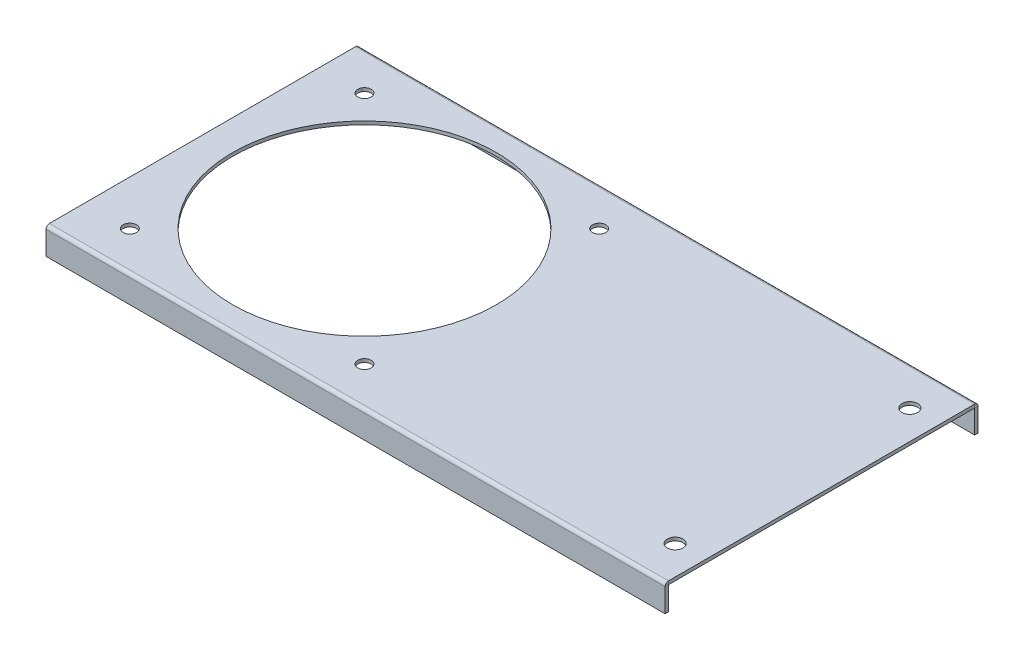
ISO-10303-21;
HEADER;
FILE_DESCRIPTION(('STEP AP214'),'2;1');
FILE_NAME('part.step','',(''),(''),'','','');
FILE_SCHEMA(('AUTOMOTIVE_DESIGN { 1 0 10303 214 1 1 1 1 }'));
ENDSEC;
DATA;
#1=APPLICATION_CONTEXT('core data for automotive mechanical design processes');
#2=APPLICATION_PROTOCOL_DEFINITION('international standard','automotive_design',2000,#1);
#3=PRODUCT_CONTEXT('',#1,'mechanical');
#4=PRODUCT('Part','Part','',(#3));
#5=PRODUCT_RELATED_PRODUCT_CATEGORY('part','',(#4));
#6=PRODUCT_DEFINITION_FORMATION('','',#4);
#7=PRODUCT_DEFINITION_CONTEXT('part definition',#1,'design');
#8=PRODUCT_DEFINITION('design','',#6,#7);
#9=PRODUCT_DEFINITION_SHAPE('','',#8);
#10=(LENGTH_UNIT() NAMED_UNIT(*) SI_UNIT(.MILLI.,.METRE.));
#11=(NAMED_UNIT(*) PLANE_ANGLE_UNIT() SI_UNIT($,.RADIAN.));
#12=(NAMED_UNIT(*) SI_UNIT($,.STERADIAN.) SOLID_ANGLE_UNIT());
#13=UNCERTAINTY_MEASURE_WITH_UNIT(LENGTH_MEASURE(1.E-05),#10,'distance_accuracy_value','');
#14=(GEOMETRIC_REPRESENTATION_CONTEXT(3) GLOBAL_UNCERTAINTY_ASSIGNED_CONTEXT((#13)) GLOBAL_UNIT_ASSIGNED_CONTEXT((#10,
#11,#12)) REPRESENTATION_CONTEXT('',''));
#15=CARTESIAN_POINT('',(0.,0.,0.));
#16=DIRECTION('',(0.,0.,1.));
#17=DIRECTION('',(1.,0.,0.));
#18=AXIS2_PLACEMENT_3D('',#15,#16,#17);
#19=CARTESIAN_POINT('',(138.5,-1.5,68.5));
#20=DIRECTION('',(1.,0.,0.));
#21=DIRECTION('',(0.,0.,-1.));
#22=AXIS2_PLACEMENT_3D('',#19,#20,#21);
#23=PLANE('',#22);
#24=DIRECTION('',(0.,1.,0.));
#25=VECTOR('',#24,1.);
#26=CARTESIAN_POINT('',(138.5,-1.5,68.5));
#27=LINE('',#26,#25);
#28=CARTESIAN_POINT('',(138.5,-1.5,68.5));
#29=VERTEX_POINT('',#28);
#30=CARTESIAN_POINT('',(138.5,0.,68.5));
#31=VERTEX_POINT('',#30);
#32=EDGE_CURVE('E11',#29,#31,#27,.T.);
#33=ORIENTED_EDGE('',*,*,#32,.F.);
#34=DIRECTION('',(0.,0.,-1.));
#35=VECTOR('',#34,1.);
#36=CARTESIAN_POINT('',(138.5,-1.5,70.));
#37=LINE('',#36,#35);
#38=CARTESIAN_POINT('',(138.5,-1.49999999999998,-68.5));
#39=VERTEX_POINT('',#38);
#40=EDGE_CURVE('E141',#29,#39,#37,.T.);
#41=ORIENTED_EDGE('',*,*,#40,.T.);
#42=DIRECTION('',(0.,1.,0.));
#43=VECTOR('',#42,1.);
#44=CARTESIAN_POINT('',(138.5,-1.49999999999998,-68.5));
#45=LINE('',#44,#43);
#46=CARTESIAN_POINT('',(138.5,0.,-68.5));
#47=VERTEX_POINT('',#46);
#48=EDGE_CURVE('E204',#39,#47,#45,.T.);
#49=ORIENTED_EDGE('',*,*,#48,.T.);
#50=DIRECTION('',(0.,0.,-1.));
#51=VECTOR('',#50,1.);
#52=CARTESIAN_POINT('',(138.5,0.,70.));
#53=LINE('',#52,#51);
#54=EDGE_CURVE('E262',#31,#47,#53,.T.);
#55=ORIENTED_EDGE('',*,*,#54,.F.);
#56=EDGE_LOOP('',(#33,#41,#49,#55));
#57=FACE_BOUND('',#56,.T.);
#58=ADVANCED_FACE('F35',(#57),#23,.T.);
#59=CARTESIAN_POINT('',(138.5,-1.5,68.5));
#60=DIRECTION('',(1.,0.,0.));
#61=DIRECTION('',(0.,0.,-1.));
#62=AXIS2_PLACEMENT_3D('',#59,#60,#61);
#63=PLANE('',#62);
#64=DIRECTION('',(0.,0.,1.));
#65=VECTOR('',#64,1.);
#66=CARTESIAN_POINT('',(138.5,-1.5,68.5));
#67=LINE('',#66,#65);
#68=CARTESIAN_POINT('',(138.5,-1.5,70.));
#69=VERTEX_POINT('',#68);
#70=EDGE_CURVE('E44',#29,#69,#67,.T.);
#71=ORIENTED_EDGE('',*,*,#70,.F.);
#72=ORIENTED_EDGE('',*,*,#32,.T.);
#73=CARTESIAN_POINT('',(138.5,-1.5,68.5));
#74=DIRECTION('',(1.,0.,0.));
#75=DIRECTION('',(0.,0.,-1.));
#76=AXIS2_PLACEMENT_3D('',#73,#74,#75);
#77=CIRCLE('',#76,1.5);
#78=EDGE_CURVE('E148',#69,#31,#77,.F.);
#79=ORIENTED_EDGE('',*,*,#78,.F.);
#80=EDGE_LOOP('',(#71,#72,#79));
#81=FACE_BOUND('',#80,.T.);
#82=ADVANCED_FACE('F274',(#81),#63,.T.);
#83=CARTESIAN_POINT('',(-138.5,-1.5,68.5));
#84=DIRECTION('',(-1.,0.,0.));
#85=DIRECTION('',(0.,0.,1.));
#86=AXIS2_PLACEMENT_3D('',#83,#84,#85);
#87=PLANE('',#86);
#88=DIRECTION('',(0.,0.,1.));
#89=VECTOR('',#88,1.);
#90=CARTESIAN_POINT('',(-138.5,-1.5,68.5));
#91=LINE('',#90,#89);
#92=CARTESIAN_POINT('',(-138.5,-1.5,68.5));
#93=VERTEX_POINT('',#92);
#94=CARTESIAN_POINT('',(-138.5,-1.5,70.));
#95=VERTEX_POINT('',#94);
#96=EDGE_CURVE('E88',#93,#95,#91,.T.);
#97=ORIENTED_EDGE('',*,*,#96,.F.);
#98=DIRECTION('',(0.,1.,0.));
#99=VECTOR('',#98,1.);
#100=CARTESIAN_POINT('',(-138.5,-12.,68.5));
#101=LINE('',#100,#99);
#102=CARTESIAN_POINT('',(-138.5,-12.,68.5));
#103=VERTEX_POINT('',#102);
#104=EDGE_CURVE('E176',#103,#93,#101,.T.);
#105=ORIENTED_EDGE('',*,*,#104,.F.);
#106=DIRECTION('',(0.,0.,1.));
#107=VECTOR('',#106,1.);
#108=CARTESIAN_POINT('',(-138.5,-12.,68.5));
#109=LINE('',#108,#107);
#110=CARTESIAN_POINT('',(-138.5,-12.,70.));
#111=VERTEX_POINT('',#110);
#112=EDGE_CURVE('E128',#103,#111,#109,.T.);
#113=ORIENTED_EDGE('',*,*,#112,.T.);
#114=DIRECTION('',(0.,1.,0.));
#115=VECTOR('',#114,1.);
#116=CARTESIAN_POINT('',(-138.5,-12.,70.));
#117=LINE('',#116,#115);
#118=EDGE_CURVE('E173',#111,#95,#117,.T.);
#119=ORIENTED_EDGE('',*,*,#118,.T.);
#120=EDGE_LOOP('',(#97,#105,#113,#119));
#121=FACE_BOUND('',#120,.T.);
#122=ADVANCED_FACE('F278',(#121),#87,.T.);
#123=CARTESIAN_POINT('',(-138.5,-1.5,68.5));
#124=DIRECTION('',(-1.,0.,0.));
#125=DIRECTION('',(0.,0.,1.));
#126=AXIS2_PLACEMENT_3D('',#123,#124,#125);
#127=PLANE('',#126);
#128=DIRECTION('',(0.,1.,0.));
#129=VECTOR('',#128,1.);
#130=CARTESIAN_POINT('',(-138.5,-1.5,68.5));
#131=LINE('',#130,#129);
#132=CARTESIAN_POINT('',(-138.5,0.,68.5));
#133=VERTEX_POINT('',#132);
#134=EDGE_CURVE('E207',#93,#133,#131,.T.);
#135=ORIENTED_EDGE('',*,*,#134,.F.);
#136=ORIENTED_EDGE('',*,*,#96,.T.);
#137=CARTESIAN_POINT('',(-138.5,-1.5,68.5));
#138=DIRECTION('',(1.,0.,0.));
#139=DIRECTION('',(0.,0.,-1.));
#140=AXIS2_PLACEMENT_3D('',#137,#138,#139);
#141=CIRCLE('',#140,1.5);
#142=EDGE_CURVE('E170',#95,#133,#141,.F.);
#143=ORIENTED_EDGE('',*,*,#142,.T.);
#144=EDGE_LOOP('',(#135,#136,#143));
#145=FACE_BOUND('',#144,.T.);
#146=ADVANCED_FACE('F284',(#145),#127,.T.);
#147=CARTESIAN_POINT('',(138.5,-1.49999999999998,-68.5));
#148=DIRECTION('',(1.,0.,0.));
#149=DIRECTION('',(0.,0.,-1.));
#150=AXIS2_PLACEMENT_3D('',#147,#148,#149);
#151=PLANE('',#150);
#152=DIRECTION('',(0.,0.,-1.));
#153=VECTOR('',#152,1.);
#154=CARTESIAN_POINT('',(138.5,-1.49999999999998,-68.5));
#155=LINE('',#154,#153);
#156=CARTESIAN_POINT('',(138.5,-1.49999999999998,-70.));
#157=VERTEX_POINT('',#156);
#158=EDGE_CURVE('E53',#39,#157,#155,.T.);
#159=ORIENTED_EDGE('',*,*,#158,.F.);
#160=DIRECTION('',(0.,-1.,0.));
#161=VECTOR('',#160,1.);
#162=CARTESIAN_POINT('',(138.5,0.,-68.5));
#163=LINE('',#162,#161);
#164=CARTESIAN_POINT('',(138.5,-12.,-68.5));
#165=VERTEX_POINT('',#164);
#166=EDGE_CURVE('E101',#39,#165,#163,.T.);
#167=ORIENTED_EDGE('',*,*,#166,.T.);
#168=DIRECTION('',(0.,0.,1.));
#169=VECTOR('',#168,1.);
#170=CARTESIAN_POINT('',(138.5,-12.,-70.));
#171=LINE('',#170,#169);
#172=CARTESIAN_POINT('',(138.5,-12.,-70.));
#173=VERTEX_POINT('',#172);
#174=EDGE_CURVE('E253',#173,#165,#171,.T.);
#175=ORIENTED_EDGE('',*,*,#174,.F.);
#176=DIRECTION('',(0.,-1.,0.));
#177=VECTOR('',#176,1.);
#178=CARTESIAN_POINT('',(138.5,0.,-70.));
#179=LINE('',#178,#177);
#180=EDGE_CURVE('E256',#157,#173,#179,.T.);
#181=ORIENTED_EDGE('',*,*,#180,.F.);
#182=EDGE_LOOP('',(#159,#167,#175,#181));
#183=FACE_BOUND('',#182,.T.);
#184=ADVANCED_FACE('F286',(#183),#151,.T.);
#185=CARTESIAN_POINT('',(138.5,-1.49999999999998,-68.5));
#186=DIRECTION('',(1.,0.,0.));
#187=DIRECTION('',(0.,0.,-1.));
#188=AXIS2_PLACEMENT_3D('',#185,#186,#187);
#189=PLANE('',#188);
#190=ORIENTED_EDGE('',*,*,#48,.F.);
#191=ORIENTED_EDGE('',*,*,#158,.T.);
#192=CARTESIAN_POINT('',(138.5,-1.49999999999998,-68.5));
#193=DIRECTION('',(1.,0.,0.));
#194=DIRECTION('',(0.,0.,-1.));
#195=AXIS2_PLACEMENT_3D('',#192,#193,#194);
#196=CIRCLE('',#195,1.5);
#197=EDGE_CURVE('E259',#47,#157,#196,.F.);
#198=ORIENTED_EDGE('',*,*,#197,.F.);
#199=EDGE_LOOP('',(#190,#191,#198));
#200=FACE_BOUND('',#199,.T.);
#201=ADVANCED_FACE('F292',(#200),#189,.T.);
#202=CARTESIAN_POINT('',(-138.5,-1.49999999999998,-68.5));
#203=DIRECTION('',(-1.,0.,0.));
#204=DIRECTION('',(0.,0.,1.));
#205=AXIS2_PLACEMENT_3D('',#202,#203,#204);
#206=PLANE('',#205);
#207=DIRECTION('',(0.,1.,0.));
#208=VECTOR('',#207,1.);
#209=CARTESIAN_POINT('',(-138.5,-1.49999999999998,-68.5));
#210=LINE('',#209,#208);
#211=CARTESIAN_POINT('',(-138.5,-1.49999999999998,-68.5));
#212=VERTEX_POINT('',#211);
#213=CARTESIAN_POINT('',(-138.5,0.,-68.5));
#214=VERTEX_POINT('',#213);
#215=EDGE_CURVE('E95',#212,#214,#210,.T.);
#216=ORIENTED_EDGE('',*,*,#215,.F.);
#217=DIRECTION('',(0.,0.,-1.));
#218=VECTOR('',#217,1.);
#219=CARTESIAN_POINT('',(-138.5,-1.5,70.));
#220=LINE('',#219,#218);
#221=EDGE_CURVE('E178',#93,#212,#220,.T.);
#222=ORIENTED_EDGE('',*,*,#221,.F.);
#223=ORIENTED_EDGE('',*,*,#134,.T.);
#224=DIRECTION('',(0.,0.,-1.));
#225=VECTOR('',#224,1.);
#226=CARTESIAN_POINT('',(-138.5,0.,70.));
#227=LINE('',#226,#225);
#228=EDGE_CURVE('E168',#133,#214,#227,.T.);
#229=ORIENTED_EDGE('',*,*,#228,.T.);
#230=EDGE_LOOP('',(#216,#222,#223,#229));
#231=FACE_BOUND('',#230,.T.);
#232=ADVANCED_FACE('F282',(#231),#206,.T.);
#233=CARTESIAN_POINT('',(-138.5,-1.49999999999998,-68.5));
#234=DIRECTION('',(-1.,0.,0.));
#235=DIRECTION('',(0.,0.,1.));
#236=AXIS2_PLACEMENT_3D('',#233,#234,#235);
#237=PLANE('',#236);
#238=DIRECTION('',(0.,0.,-1.));
#239=VECTOR('',#238,1.);
#240=CARTESIAN_POINT('',(-138.5,-1.49999999999998,-68.5));
#241=LINE('',#240,#239);
#242=CARTESIAN_POINT('',(-138.5,-1.49999999999998,-70.));
#243=VERTEX_POINT('',#242);
#244=EDGE_CURVE('E201',#212,#243,#241,.T.);
#245=ORIENTED_EDGE('',*,*,#244,.F.);
#246=ORIENTED_EDGE('',*,*,#215,.T.);
#247=CARTESIAN_POINT('',(-138.5,-1.49999999999998,-68.5));
#248=DIRECTION('',(1.,0.,0.));
#249=DIRECTION('',(0.,0.,-1.));
#250=AXIS2_PLACEMENT_3D('',#247,#248,#249);
#251=CIRCLE('',#250,1.5);
#252=EDGE_CURVE('E165',#214,#243,#251,.F.);
#253=ORIENTED_EDGE('',*,*,#252,.T.);
#254=EDGE_LOOP('',(#245,#246,#253));
#255=FACE_BOUND('',#254,.T.);
#256=ADVANCED_FACE('F311',(#255),#237,.T.);
#257=CARTESIAN_POINT('',(138.5,0.,-68.5));
#258=DIRECTION('',(0.,0.,-1.));
#259=DIRECTION('',(0.,1.,0.));
#260=AXIS2_PLACEMENT_3D('',#257,#258,#259);
#261=PLANE('',#260);
#262=DIRECTION('',(0.,-1.,0.));
#263=VECTOR('',#262,1.);
#264=CARTESIAN_POINT('',(-138.5,0.,-68.5));
#265=LINE('',#264,#263);
#266=CARTESIAN_POINT('',(-138.5,-12.,-68.5));
#267=VERTEX_POINT('',#266);
#268=EDGE_CURVE('E155',#212,#267,#265,.T.);
#269=ORIENTED_EDGE('',*,*,#268,.T.);
#270=DIRECTION('',(-1.,0.,0.));
#271=VECTOR('',#270,1.);
#272=CARTESIAN_POINT('',(138.5,-12.,-68.5));
#273=LINE('',#272,#271);
#274=EDGE_CURVE('E199',#165,#267,#273,.T.);
#275=ORIENTED_EDGE('',*,*,#274,.F.);
#276=ORIENTED_EDGE('',*,*,#166,.F.);
#277=DIRECTION('',(-1.,0.,0.));
#278=VECTOR('',#277,1.);
#279=CARTESIAN_POINT('',(138.5,-1.49999999999998,-68.5));
#280=LINE('',#279,#278);
#281=EDGE_CURVE('E154',#39,#212,#280,.T.);
#282=ORIENTED_EDGE('',*,*,#281,.T.);
#283=EDGE_LOOP('',(#269,#275,#276,#282));
#284=FACE_BOUND('',#283,.T.);
#285=ADVANCED_FACE('F317',(#284),#261,.F.);
#286=CARTESIAN_POINT('',(138.5,-12.,-70.));
#287=DIRECTION('',(0.,-1.,0.));
#288=DIRECTION('',(0.,0.,-1.));
#289=AXIS2_PLACEMENT_3D('',#286,#287,#288);
#290=PLANE('',#289);
#291=DIRECTION('',(0.,0.,1.));
#292=VECTOR('',#291,1.);
#293=CARTESIAN_POINT('',(-138.5,-12.,-70.));
#294=LINE('',#293,#292);
#295=CARTESIAN_POINT('',(-138.5,-12.,-70.));
#296=VERTEX_POINT('',#295);
#297=EDGE_CURVE('E158',#296,#267,#294,.T.);
#298=ORIENTED_EDGE('',*,*,#297,.F.);
#299=DIRECTION('',(-1.,0.,0.));
#300=VECTOR('',#299,1.);
#301=CARTESIAN_POINT('',(138.5,-12.,-70.));
#302=LINE('',#301,#300);
#303=EDGE_CURVE('E197',#173,#296,#302,.T.);
#304=ORIENTED_EDGE('',*,*,#303,.F.);
#305=ORIENTED_EDGE('',*,*,#174,.T.);
#306=ORIENTED_EDGE('',*,*,#274,.T.);
#307=EDGE_LOOP('',(#298,#304,#305,#306));
#308=FACE_BOUND('',#307,.T.);
#309=ADVANCED_FACE('F319',(#308),#290,.T.);
#310=CARTESIAN_POINT('',(138.5,0.,-70.));
#311=DIRECTION('',(0.,0.,-1.));
#312=DIRECTION('',(0.,1.,0.));
#313=AXIS2_PLACEMENT_3D('',#310,#311,#312);
#314=PLANE('',#313);
#315=DIRECTION('',(0.,-1.,0.));
#316=VECTOR('',#315,1.);
#317=CARTESIAN_POINT('',(-138.5,0.,-70.));
#318=LINE('',#317,#316);
#319=EDGE_CURVE('E162',#243,#296,#318,.T.);
#320=ORIENTED_EDGE('',*,*,#319,.F.);
#321=DIRECTION('',(-1.,0.,0.));
#322=VECTOR('',#321,1.);
#323=CARTESIAN_POINT('',(138.5,-1.49999999999998,-70.));
#324=LINE('',#323,#322);
#325=EDGE_CURVE('E194',#157,#243,#324,.T.);
#326=ORIENTED_EDGE('',*,*,#325,.F.);
#327=ORIENTED_EDGE('',*,*,#180,.T.);
#328=ORIENTED_EDGE('',*,*,#303,.T.);
#329=EDGE_LOOP('',(#320,#326,#327,#328));
#330=FACE_BOUND('',#329,.T.);
#331=ADVANCED_FACE('F321',(#330),#314,.T.);
#332=CARTESIAN_POINT('',(138.5,-1.49999999999998,-68.5));
#333=DIRECTION('',(-1.,0.,0.));
#334=DIRECTION('',(0.,0.,1.));
#335=AXIS2_PLACEMENT_3D('',#332,#333,#334);
#336=CYLINDRICAL_SURFACE('',#335,1.5);
#337=ORIENTED_EDGE('',*,*,#252,.F.);
#338=DIRECTION('',(-1.,0.,0.));
#339=VECTOR('',#338,1.);
#340=CARTESIAN_POINT('',(138.5,0.,-68.5));
#341=LINE('',#340,#339);
#342=EDGE_CURVE('E191',#47,#214,#341,.T.);
#343=ORIENTED_EDGE('',*,*,#342,.F.);
#344=ORIENTED_EDGE('',*,*,#197,.T.);
#345=ORIENTED_EDGE('',*,*,#325,.T.);
#346=EDGE_LOOP('',(#337,#343,#344,#345));
#347=FACE_BOUND('',#346,.T.);
#348=ADVANCED_FACE('F307',(#347),#336,.T.);
#349=CARTESIAN_POINT('',(138.5,0.,70.));
#350=DIRECTION('',(0.,1.,0.));
#351=DIRECTION('',(0.,0.,1.));
#352=AXIS2_PLACEMENT_3D('',#349,#350,#351);
#353=PLANE('',#352);
#354=CARTESIAN_POINT('',(125.5,0.,52.5));
#355=DIRECTION('',(0.,1.,0.));
#356=DIRECTION('',(0.,0.,1.));
#357=AXIS2_PLACEMENT_3D('',#354,#355,#356);
#358=CIRCLE('',#357,3.49999999999999);
#359=CARTESIAN_POINT('',(125.5,0.,56.));
#360=VERTEX_POINT('',#359);
#361=EDGE_CURVE('E241',#360,#360,#358,.T.);
#362=ORIENTED_EDGE('',*,*,#361,.F.);
#363=EDGE_LOOP('',(#362));
#364=FACE_BOUND('',#363,.T.);
#365=CARTESIAN_POINT('',(125.5,0.,-52.5));
#366=DIRECTION('',(0.,1.,0.));
#367=DIRECTION('',(0.,0.,1.));
#368=AXIS2_PLACEMENT_3D('',#365,#366,#367);
#369=CIRCLE('',#368,3.49999999999999);
#370=CARTESIAN_POINT('',(125.5,0.,-49.));
#371=VERTEX_POINT('',#370);
#372=EDGE_CURVE('E231',#371,#371,#369,.T.);
#373=ORIENTED_EDGE('',*,*,#372,.F.);
#374=EDGE_LOOP('',(#373));
#375=FACE_BOUND('',#374,.T.);
#376=CARTESIAN_POINT('',(-118.5,0.,52.5));
#377=DIRECTION('',(0.,1.,0.));
#378=DIRECTION('',(0.,0.,1.));
#379=AXIS2_PLACEMENT_3D('',#376,#377,#378);
#380=CIRCLE('',#379,3.00000000000001);
#381=CARTESIAN_POINT('',(-118.5,0.,55.5));
#382=VERTEX_POINT('',#381);
#383=EDGE_CURVE('E228',#382,#382,#380,.T.);
#384=ORIENTED_EDGE('',*,*,#383,.F.);
#385=EDGE_LOOP('',(#384));
#386=FACE_BOUND('',#385,.T.);
#387=CARTESIAN_POINT('',(-13.5,0.,52.5));
#388=DIRECTION('',(0.,1.,0.));
#389=DIRECTION('',(0.,0.,1.));
#390=AXIS2_PLACEMENT_3D('',#387,#388,#389);
#391=CIRCLE('',#390,3.);
#392=CARTESIAN_POINT('',(-13.5,0.,55.5));
#393=VERTEX_POINT('',#392);
#394=EDGE_CURVE('E225',#393,#393,#391,.T.);
#395=ORIENTED_EDGE('',*,*,#394,.F.);
#396=EDGE_LOOP('',(#395));
#397=FACE_BOUND('',#396,.T.);
#398=CARTESIAN_POINT('',(-13.5,0.,-52.5));
#399=DIRECTION('',(0.,1.,0.));
#400=DIRECTION('',(0.,0.,1.));
#401=AXIS2_PLACEMENT_3D('',#398,#399,#400);
#402=CIRCLE('',#401,3.);
#403=CARTESIAN_POINT('',(-13.5,0.,-49.5));
#404=VERTEX_POINT('',#403);
#405=EDGE_CURVE('E221',#404,#404,#402,.T.);
#406=ORIENTED_EDGE('',*,*,#405,.F.);
#407=EDGE_LOOP('',(#406));
#408=FACE_BOUND('',#407,.T.);
#409=CARTESIAN_POINT('',(-118.5,0.,-52.5));
#410=DIRECTION('',(0.,1.,0.));
#411=DIRECTION('',(0.,0.,1.));
#412=AXIS2_PLACEMENT_3D('',#409,#410,#411);
#413=CIRCLE('',#412,3.00000000000001);
#414=CARTESIAN_POINT('',(-118.5,0.,-49.5));
#415=VERTEX_POINT('',#414);
#416=EDGE_CURVE('E217',#415,#415,#413,.T.);
#417=ORIENTED_EDGE('',*,*,#416,.F.);
#418=EDGE_LOOP('',(#417));
#419=FACE_BOUND('',#418,.T.);
#420=CARTESIAN_POINT('',(-66.,0.,0.));
#421=DIRECTION('',(0.,1.,0.));
#422=DIRECTION('',(0.,0.,1.));
#423=AXIS2_PLACEMENT_3D('',#420,#421,#422);
#424=CIRCLE('',#423,59.);
#425=CARTESIAN_POINT('',(-66.,0.,59.));
#426=VERTEX_POINT('',#425);
#427=EDGE_CURVE('E213',#426,#426,#424,.T.);
#428=ORIENTED_EDGE('',*,*,#427,.F.);
#429=EDGE_LOOP('',(#428));
#430=FACE_BOUND('',#429,.T.);
#431=ORIENTED_EDGE('',*,*,#228,.F.);
#432=DIRECTION('',(-1.,0.,0.));
#433=VECTOR('',#432,1.);
#434=CARTESIAN_POINT('',(138.5,0.,68.5));
#435=LINE('',#434,#433);
#436=EDGE_CURVE('E188',#31,#133,#435,.T.);
#437=ORIENTED_EDGE('',*,*,#436,.F.);
#438=ORIENTED_EDGE('',*,*,#54,.T.);
#439=ORIENTED_EDGE('',*,*,#342,.T.);
#440=EDGE_LOOP('',(#431,#437,#438,#439));
#441=FACE_BOUND('',#440,.T.);
#442=ADVANCED_FACE('F303',(#364,#375,#386,#397,#408,#419,#430,#441),#353,.T.);
#443=CARTESIAN_POINT('',(138.5,-1.5,68.5));
#444=DIRECTION('',(-1.,0.,0.));
#445=DIRECTION('',(0.,0.,1.));
#446=AXIS2_PLACEMENT_3D('',#443,#444,#445);
#447=CYLINDRICAL_SURFACE('',#446,1.5);
#448=ORIENTED_EDGE('',*,*,#142,.F.);
#449=DIRECTION('',(-1.,0.,0.));
#450=VECTOR('',#449,1.);
#451=CARTESIAN_POINT('',(138.5,-1.5,70.));
#452=LINE('',#451,#450);
#453=EDGE_CURVE('E185',#69,#95,#452,.T.);
#454=ORIENTED_EDGE('',*,*,#453,.F.);
#455=ORIENTED_EDGE('',*,*,#78,.T.);
#456=ORIENTED_EDGE('',*,*,#436,.T.);
#457=EDGE_LOOP('',(#448,#454,#455,#456));
#458=FACE_BOUND('',#457,.T.);
#459=ADVANCED_FACE('F269',(#458),#447,.T.);
#460=CARTESIAN_POINT('',(138.5,-12.,70.));
#461=DIRECTION('',(0.,0.,1.));
#462=DIRECTION('',(0.,-1.,0.));
#463=AXIS2_PLACEMENT_3D('',#460,#461,#462);
#464=PLANE('',#463);
#465=ORIENTED_EDGE('',*,*,#118,.F.);
#466=DIRECTION('',(-1.,0.,0.));
#467=VECTOR('',#466,1.);
#468=CARTESIAN_POINT('',(138.5,-12.,70.));
#469=LINE('',#468,#467);
#470=CARTESIAN_POINT('',(138.5,-12.,70.));
#471=VERTEX_POINT('',#470);
#472=EDGE_CURVE('E131',#471,#111,#469,.T.);
#473=ORIENTED_EDGE('',*,*,#472,.F.);
#474=DIRECTION('',(0.,1.,0.));
#475=VECTOR('',#474,1.);
#476=CARTESIAN_POINT('',(138.5,-12.,70.));
#477=LINE('',#476,#475);
#478=EDGE_CURVE('E146',#471,#69,#477,.T.);
#479=ORIENTED_EDGE('',*,*,#478,.T.);
#480=ORIENTED_EDGE('',*,*,#453,.T.);
#481=EDGE_LOOP('',(#465,#473,#479,#480));
#482=FACE_BOUND('',#481,.T.);
#483=ADVANCED_FACE('F277',(#482),#464,.T.);
#484=CARTESIAN_POINT('',(138.5,-12.,68.5));
#485=DIRECTION('',(0.,-1.,0.));
#486=DIRECTION('',(0.,0.,-1.));
#487=AXIS2_PLACEMENT_3D('',#484,#485,#486);
#488=PLANE('',#487);
#489=ORIENTED_EDGE('',*,*,#112,.F.);
#490=DIRECTION('',(-1.,0.,0.));
#491=VECTOR('',#490,1.);
#492=CARTESIAN_POINT('',(138.5,-12.,68.5));
#493=LINE('',#492,#491);
#494=CARTESIAN_POINT('',(138.5,-12.,68.5));
#495=VERTEX_POINT('',#494);
#496=EDGE_CURVE('E122',#495,#103,#493,.T.);
#497=ORIENTED_EDGE('',*,*,#496,.F.);
#498=DIRECTION('',(0.,0.,1.));
#499=VECTOR('',#498,1.);
#500=CARTESIAN_POINT('',(138.5,-12.,68.5));
#501=LINE('',#500,#499);
#502=EDGE_CURVE('E126',#495,#471,#501,.T.);
#503=ORIENTED_EDGE('',*,*,#502,.T.);
#504=ORIENTED_EDGE('',*,*,#472,.T.);
#505=EDGE_LOOP('',(#489,#497,#503,#504));
#506=FACE_BOUND('',#505,.T.);
#507=ADVANCED_FACE('F124',(#506),#488,.T.);
#508=CARTESIAN_POINT('',(138.5,-12.,68.5));
#509=DIRECTION('',(0.,0.,1.));
#510=DIRECTION('',(0.,-1.,0.));
#511=AXIS2_PLACEMENT_3D('',#508,#509,#510);
#512=PLANE('',#511);
#513=ORIENTED_EDGE('',*,*,#104,.T.);
#514=DIRECTION('',(-1.,0.,0.));
#515=VECTOR('',#514,1.);
#516=CARTESIAN_POINT('',(138.5,-1.5,68.5));
#517=LINE('',#516,#515);
#518=EDGE_CURVE('E132',#29,#93,#517,.T.);
#519=ORIENTED_EDGE('',*,*,#518,.F.);
#520=DIRECTION('',(0.,1.,0.));
#521=VECTOR('',#520,1.);
#522=CARTESIAN_POINT('',(138.5,-12.,68.5));
#523=LINE('',#522,#521);
#524=EDGE_CURVE('E136',#495,#29,#523,.T.);
#525=ORIENTED_EDGE('',*,*,#524,.F.);
#526=ORIENTED_EDGE('',*,*,#496,.T.);
#527=EDGE_LOOP('',(#513,#519,#525,#526));
#528=FACE_BOUND('',#527,.T.);
#529=ADVANCED_FACE('F137',(#528),#512,.F.);
#530=CARTESIAN_POINT('',(138.5,-1.5,70.));
#531=DIRECTION('',(0.,1.,0.));
#532=DIRECTION('',(0.,0.,1.));
#533=AXIS2_PLACEMENT_3D('',#530,#531,#532);
#534=PLANE('',#533);
#535=CARTESIAN_POINT('',(125.5,-1.5,52.5));
#536=DIRECTION('',(0.,1.,0.));
#537=DIRECTION('',(0.,0.,1.));
#538=AXIS2_PLACEMENT_3D('',#535,#536,#537);
#539=CIRCLE('',#538,3.49999999999999);
#540=CARTESIAN_POINT('',(125.5,-1.5,56.));
#541=VERTEX_POINT('',#540);
#542=EDGE_CURVE('E38',#541,#541,#539,.T.);
#543=ORIENTED_EDGE('',*,*,#542,.T.);
#544=EDGE_LOOP('',(#543));
#545=FACE_BOUND('',#544,.T.);
#546=CARTESIAN_POINT('',(125.5,-1.49999999999998,-52.5));
#547=DIRECTION('',(0.,1.,0.));
#548=DIRECTION('',(0.,0.,1.));
#549=AXIS2_PLACEMENT_3D('',#546,#547,#548);
#550=CIRCLE('',#549,3.49999999999999);
#551=CARTESIAN_POINT('',(125.5,-1.49999999999998,-49.));
#552=VERTEX_POINT('',#551);
#553=EDGE_CURVE('E229',#552,#552,#550,.T.);
#554=ORIENTED_EDGE('',*,*,#553,.T.);
#555=EDGE_LOOP('',(#554));
#556=FACE_BOUND('',#555,.T.);
#557=CARTESIAN_POINT('',(-118.5,-1.5,52.5));
#558=DIRECTION('',(0.,1.,0.));
#559=DIRECTION('',(0.,0.,1.));
#560=AXIS2_PLACEMENT_3D('',#557,#558,#559);
#561=CIRCLE('',#560,3.00000000000001);
#562=CARTESIAN_POINT('',(-118.5,-1.5,55.5));
#563=VERTEX_POINT('',#562);
#564=EDGE_CURVE('E226',#563,#563,#561,.T.);
#565=ORIENTED_EDGE('',*,*,#564,.T.);
#566=EDGE_LOOP('',(#565));
#567=FACE_BOUND('',#566,.T.);
#568=CARTESIAN_POINT('',(-13.5,-1.5,52.5));
#569=DIRECTION('',(0.,1.,0.));
#570=DIRECTION('',(0.,0.,1.));
#571=AXIS2_PLACEMENT_3D('',#568,#569,#570);
#572=CIRCLE('',#571,3.);
#573=CARTESIAN_POINT('',(-13.5,-1.5,55.5));
#574=VERTEX_POINT('',#573);
#575=EDGE_CURVE('E222',#574,#574,#572,.T.);
#576=ORIENTED_EDGE('',*,*,#575,.T.);
#577=EDGE_LOOP('',(#576));
#578=FACE_BOUND('',#577,.T.);
#579=CARTESIAN_POINT('',(-13.5,-1.49999999999998,-52.5));
#580=DIRECTION('',(0.,1.,0.));
#581=DIRECTION('',(0.,0.,1.));
#582=AXIS2_PLACEMENT_3D('',#579,#580,#581);
#583=CIRCLE('',#582,3.);
#584=CARTESIAN_POINT('',(-13.5,-1.49999999999998,-49.5));
#585=VERTEX_POINT('',#584);
#586=EDGE_CURVE('E218',#585,#585,#583,.T.);
#587=ORIENTED_EDGE('',*,*,#586,.T.);
#588=EDGE_LOOP('',(#587));
#589=FACE_BOUND('',#588,.T.);
#590=CARTESIAN_POINT('',(-118.5,-1.49999999999998,-52.5));
#591=DIRECTION('',(0.,1.,0.));
#592=DIRECTION('',(0.,0.,1.));
#593=AXIS2_PLACEMENT_3D('',#590,#591,#592);
#594=CIRCLE('',#593,3.00000000000001);
#595=CARTESIAN_POINT('',(-118.5,-1.49999999999998,-49.5));
#596=VERTEX_POINT('',#595);
#597=EDGE_CURVE('E214',#596,#596,#594,.T.);
#598=ORIENTED_EDGE('',*,*,#597,.T.);
#599=EDGE_LOOP('',(#598));
#600=FACE_BOUND('',#599,.T.);
#601=CARTESIAN_POINT('',(-66.,-1.49999999999999,0.));
#602=DIRECTION('',(0.,1.,0.));
#603=DIRECTION('',(0.,0.,1.));
#604=AXIS2_PLACEMENT_3D('',#601,#602,#603);
#605=CIRCLE('',#604,59.);
#606=CARTESIAN_POINT('',(-66.,-1.5,59.));
#607=VERTEX_POINT('',#606);
#608=EDGE_CURVE('E159',#607,#607,#605,.T.);
#609=ORIENTED_EDGE('',*,*,#608,.T.);
#610=EDGE_LOOP('',(#609));
#611=FACE_BOUND('',#610,.T.);
#612=ORIENTED_EDGE('',*,*,#221,.T.);
#613=ORIENTED_EDGE('',*,*,#281,.F.);
#614=ORIENTED_EDGE('',*,*,#40,.F.);
#615=ORIENTED_EDGE('',*,*,#518,.T.);
#616=EDGE_LOOP('',(#612,#613,#614,#615));
#617=FACE_BOUND('',#616,.T.);
#618=ADVANCED_FACE('F280',(#545,#556,#567,#578,#589,#600,#611,#617),#534,.F.);
#619=CARTESIAN_POINT('',(138.5,-1.49999999999998,-68.5));
#620=DIRECTION('',(1.,0.,0.));
#621=DIRECTION('',(0.,0.,-1.));
#622=AXIS2_PLACEMENT_3D('',#619,#620,#621);
#623=PLANE('',#622);
#624=ORIENTED_EDGE('',*,*,#524,.T.);
#625=ORIENTED_EDGE('',*,*,#70,.T.);
#626=ORIENTED_EDGE('',*,*,#478,.F.);
#627=ORIENTED_EDGE('',*,*,#502,.F.);
#628=EDGE_LOOP('',(#624,#625,#626,#627));
#629=FACE_BOUND('',#628,.T.);
#630=ADVANCED_FACE('F144',(#629),#623,.T.);
#631=CARTESIAN_POINT('',(-138.5,-1.49999999999998,-68.5));
#632=DIRECTION('',(1.,0.,0.));
#633=DIRECTION('',(0.,0.,-1.));
#634=AXIS2_PLACEMENT_3D('',#631,#632,#633);
#635=PLANE('',#634);
#636=ORIENTED_EDGE('',*,*,#268,.F.);
#637=ORIENTED_EDGE('',*,*,#244,.T.);
#638=ORIENTED_EDGE('',*,*,#319,.T.);
#639=ORIENTED_EDGE('',*,*,#297,.T.);
#640=EDGE_LOOP('',(#636,#637,#638,#639));
#641=FACE_BOUND('',#640,.T.);
#642=ADVANCED_FACE('F314',(#641),#635,.F.);
#643=CARTESIAN_POINT('',(-66.,-12.,0.));
#644=DIRECTION('',(0.,1.,0.));
#645=DIRECTION('',(0.,0.,1.));
#646=AXIS2_PLACEMENT_3D('',#643,#644,#645);
#647=CYLINDRICAL_SURFACE('',#646,59.);
#648=ORIENTED_EDGE('',*,*,#427,.T.);
#649=EDGE_LOOP('',(#648));
#650=FACE_BOUND('',#649,.T.);
#651=ORIENTED_EDGE('',*,*,#608,.F.);
#652=EDGE_LOOP('',(#651));
#653=FACE_BOUND('',#652,.T.);
#654=ADVANCED_FACE('F431',(#650,#653),#647,.F.);
#655=CARTESIAN_POINT('',(-118.5,-12.,-52.5));
#656=DIRECTION('',(0.,1.,0.));
#657=DIRECTION('',(0.,0.,1.));
#658=AXIS2_PLACEMENT_3D('',#655,#656,#657);
#659=CYLINDRICAL_SURFACE('',#658,3.00000000000001);
#660=ORIENTED_EDGE('',*,*,#416,.T.);
#661=EDGE_LOOP('',(#660));
#662=FACE_BOUND('',#661,.T.);
#663=ORIENTED_EDGE('',*,*,#597,.F.);
#664=EDGE_LOOP('',(#663));
#665=FACE_BOUND('',#664,.T.);
#666=ADVANCED_FACE('F456',(#662,#665),#659,.F.);
#667=CARTESIAN_POINT('',(-13.5,-12.,-52.5));
#668=DIRECTION('',(0.,1.,0.));
#669=DIRECTION('',(0.,0.,1.));
#670=AXIS2_PLACEMENT_3D('',#667,#668,#669);
#671=CYLINDRICAL_SURFACE('',#670,3.);
#672=ORIENTED_EDGE('',*,*,#405,.T.);
#673=EDGE_LOOP('',(#672));
#674=FACE_BOUND('',#673,.T.);
#675=ORIENTED_EDGE('',*,*,#586,.F.);
#676=EDGE_LOOP('',(#675));
#677=FACE_BOUND('',#676,.T.);
#678=ADVANCED_FACE('F466',(#674,#677),#671,.F.);
#679=CARTESIAN_POINT('',(-13.5,-12.,52.5));
#680=DIRECTION('',(0.,1.,0.));
#681=DIRECTION('',(0.,0.,1.));
#682=AXIS2_PLACEMENT_3D('',#679,#680,#681);
#683=CYLINDRICAL_SURFACE('',#682,3.);
#684=ORIENTED_EDGE('',*,*,#394,.T.);
#685=EDGE_LOOP('',(#684));
#686=FACE_BOUND('',#685,.T.);
#687=ORIENTED_EDGE('',*,*,#575,.F.);
#688=EDGE_LOOP('',(#687));
#689=FACE_BOUND('',#688,.T.);
#690=ADVANCED_FACE('F476',(#686,#689),#683,.F.);
#691=CARTESIAN_POINT('',(-118.5,-12.,52.5));
#692=DIRECTION('',(0.,1.,0.));
#693=DIRECTION('',(0.,0.,1.));
#694=AXIS2_PLACEMENT_3D('',#691,#692,#693);
#695=CYLINDRICAL_SURFACE('',#694,3.00000000000001);
#696=ORIENTED_EDGE('',*,*,#383,.T.);
#697=EDGE_LOOP('',(#696));
#698=FACE_BOUND('',#697,.T.);
#699=ORIENTED_EDGE('',*,*,#564,.F.);
#700=EDGE_LOOP('',(#699));
#701=FACE_BOUND('',#700,.T.);
#702=ADVANCED_FACE('F486',(#698,#701),#695,.F.);
#703=CARTESIAN_POINT('',(125.5,-12.,-52.5));
#704=DIRECTION('',(0.,1.,0.));
#705=DIRECTION('',(0.,0.,1.));
#706=AXIS2_PLACEMENT_3D('',#703,#704,#705);
#707=CYLINDRICAL_SURFACE('',#706,3.49999999999999);
#708=ORIENTED_EDGE('',*,*,#372,.T.);
#709=EDGE_LOOP('',(#708));
#710=FACE_BOUND('',#709,.T.);
#711=ORIENTED_EDGE('',*,*,#553,.F.);
#712=EDGE_LOOP('',(#711));
#713=FACE_BOUND('',#712,.T.);
#714=ADVANCED_FACE('F496',(#710,#713),#707,.F.);
#715=CARTESIAN_POINT('',(125.5,-12.,52.5));
#716=DIRECTION('',(0.,1.,0.));
#717=DIRECTION('',(0.,0.,1.));
#718=AXIS2_PLACEMENT_3D('',#715,#716,#717);
#719=CYLINDRICAL_SURFACE('',#718,3.49999999999999);
#720=ORIENTED_EDGE('',*,*,#361,.T.);
#721=EDGE_LOOP('',(#720));
#722=FACE_BOUND('',#721,.T.);
#723=ORIENTED_EDGE('',*,*,#542,.F.);
#724=EDGE_LOOP('',(#723));
#725=FACE_BOUND('',#724,.T.);
#726=ADVANCED_FACE('F506',(#722,#725),#719,.F.);
#727=CLOSED_SHELL('',(#58,#82,#122,#146,#184,#201,#232,#256,#285,#309,#331,#348,#442,#459,#483,
#507,#529,#618,#630,#642,#654,#666,#678,#690,#702,#714,#726));
#728=MANIFOLD_SOLID_BREP('B2',#727);
#729=ADVANCED_BREP_SHAPE_REPRESENTATION('',(#18,#728),#14);
#730=SHAPE_DEFINITION_REPRESENTATION(#9,#729);
ENDSEC;
END-ISO-10303-21;
